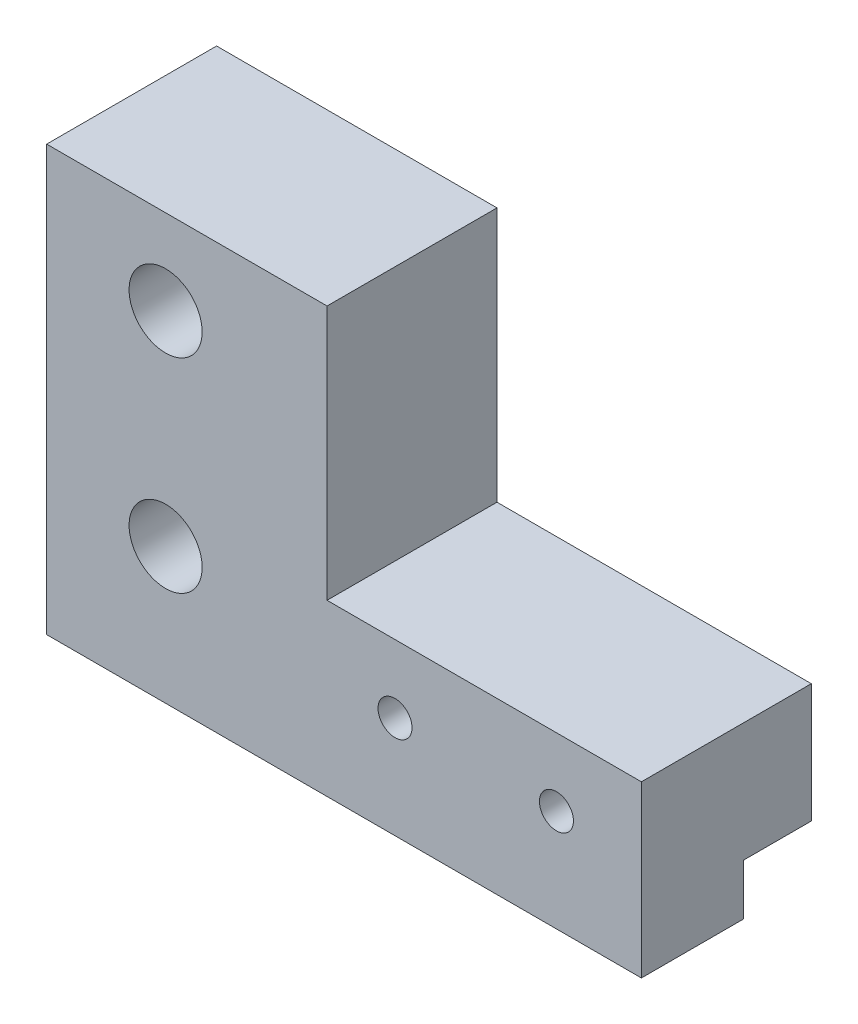
ISO-10303-21;
HEADER;
FILE_DESCRIPTION(('STEP AP214'),'2;1');
FILE_NAME('part.step','',(''),(''),'','','');
FILE_SCHEMA(('AUTOMOTIVE_DESIGN { 1 0 10303 214 1 1 1 1 }'));
ENDSEC;
DATA;
#1=APPLICATION_CONTEXT('core data for automotive mechanical design processes');
#2=APPLICATION_PROTOCOL_DEFINITION('international standard','automotive_design',2000,#1);
#3=PRODUCT_CONTEXT('',#1,'mechanical');
#4=PRODUCT('Part','Part','',(#3));
#5=PRODUCT_RELATED_PRODUCT_CATEGORY('part','',(#4));
#6=PRODUCT_DEFINITION_FORMATION('','',#4);
#7=PRODUCT_DEFINITION_CONTEXT('part definition',#1,'design');
#8=PRODUCT_DEFINITION('design','',#6,#7);
#9=PRODUCT_DEFINITION_SHAPE('','',#8);
#10=(LENGTH_UNIT() NAMED_UNIT(*) SI_UNIT(.MILLI.,.METRE.));
#11=(NAMED_UNIT(*) PLANE_ANGLE_UNIT() SI_UNIT($,.RADIAN.));
#12=(NAMED_UNIT(*) SI_UNIT($,.STERADIAN.) SOLID_ANGLE_UNIT());
#13=UNCERTAINTY_MEASURE_WITH_UNIT(LENGTH_MEASURE(1.E-05),#10,'distance_accuracy_value','');
#14=(GEOMETRIC_REPRESENTATION_CONTEXT(3) GLOBAL_UNCERTAINTY_ASSIGNED_CONTEXT((#13)) GLOBAL_UNIT_ASSIGNED_CONTEXT((#10,
#11,#12)) REPRESENTATION_CONTEXT('',''));
#15=CARTESIAN_POINT('',(0.,0.,0.));
#16=DIRECTION('',(0.,0.,1.));
#17=DIRECTION('',(1.,0.,0.));
#18=AXIS2_PLACEMENT_3D('',#15,#16,#17);
#19=CARTESIAN_POINT('',(0.,0.,10.));
#20=DIRECTION('',(0.,0.,1.));
#21=DIRECTION('',(1.,0.,0.));
#22=AXIS2_PLACEMENT_3D('',#19,#20,#21);
#23=PLANE('',#22);
#24=CARTESIAN_POINT('',(-17.,-14.,10.));
#25=DIRECTION('',(0.,0.,1.));
#26=DIRECTION('',(1.,0.,0.));
#27=AXIS2_PLACEMENT_3D('',#24,#25,#26);
#28=CIRCLE('',#27,1.);
#29=CARTESIAN_POINT('',(-16.,-14.,10.));
#30=VERTEX_POINT('',#29);
#31=EDGE_CURVE('E279',#30,#30,#28,.T.);
#32=ORIENTED_EDGE('',*,*,#31,.F.);
#33=EDGE_LOOP('',(#32));
#34=FACE_BOUND('',#33,.T.);
#35=CARTESIAN_POINT('',(-7.5,-14.,10.));
#36=DIRECTION('',(0.,0.,1.));
#37=DIRECTION('',(1.,0.,0.));
#38=AXIS2_PLACEMENT_3D('',#35,#36,#37);
#39=CIRCLE('',#38,1.);
#40=CARTESIAN_POINT('',(-6.5,-14.,10.));
#41=VERTEX_POINT('',#40);
#42=EDGE_CURVE('E273',#41,#41,#39,.T.);
#43=ORIENTED_EDGE('',*,*,#42,.F.);
#44=EDGE_LOOP('',(#43));
#45=FACE_BOUND('',#44,.T.);
#46=DIRECTION('',(0.,-1.,0.));
#47=VECTOR('',#46,1.);
#48=CARTESIAN_POINT('',(-2.5,4.99999999999999,10.));
#49=LINE('',#48,#47);
#50=CARTESIAN_POINT('',(-2.5,-10.,10.));
#51=VERTEX_POINT('',#50);
#52=CARTESIAN_POINT('',(-2.5,-20.,10.));
#53=VERTEX_POINT('',#52);
#54=EDGE_CURVE('E104',#51,#53,#49,.T.);
#55=ORIENTED_EDGE('',*,*,#54,.F.);
#56=DIRECTION('',(-1.,0.,0.));
#57=VECTOR('',#56,1.);
#58=CARTESIAN_POINT('',(-21.,-10.,10.));
#59=LINE('',#58,#57);
#60=CARTESIAN_POINT('',(-21.,-10.,10.));
#61=VERTEX_POINT('',#60);
#62=EDGE_CURVE('E121',#51,#61,#59,.T.);
#63=ORIENTED_EDGE('',*,*,#62,.T.);
#64=DIRECTION('',(0.,1.,0.));
#65=VECTOR('',#64,1.);
#66=CARTESIAN_POINT('',(-21.,4.99999999999999,10.));
#67=LINE('',#66,#65);
#68=CARTESIAN_POINT('',(-21.,4.99999999999999,10.));
#69=VERTEX_POINT('',#68);
#70=EDGE_CURVE('E123',#61,#69,#67,.T.);
#71=ORIENTED_EDGE('',*,*,#70,.T.);
#72=DIRECTION('',(-1.,0.,0.));
#73=VECTOR('',#72,1.);
#74=CARTESIAN_POINT('',(-37.5,4.99999999999999,10.));
#75=LINE('',#74,#73);
#76=CARTESIAN_POINT('',(-37.5,4.99999999999999,10.));
#77=VERTEX_POINT('',#76);
#78=EDGE_CURVE('E55',#69,#77,#75,.T.);
#79=ORIENTED_EDGE('',*,*,#78,.T.);
#80=DIRECTION('',(0.,-1.,0.));
#81=VECTOR('',#80,1.);
#82=CARTESIAN_POINT('',(-37.5,4.99999999999999,10.));
#83=LINE('',#82,#81);
#84=CARTESIAN_POINT('',(-37.5,-20.,10.));
#85=VERTEX_POINT('',#84);
#86=EDGE_CURVE('E119',#77,#85,#83,.T.);
#87=ORIENTED_EDGE('',*,*,#86,.T.);
#88=DIRECTION('',(1.,0.,0.));
#89=VECTOR('',#88,1.);
#90=CARTESIAN_POINT('',(-37.5,-20.,10.));
#91=LINE('',#90,#89);
#92=EDGE_CURVE('E80',#85,#53,#91,.T.);
#93=ORIENTED_EDGE('',*,*,#92,.T.);
#94=EDGE_LOOP('',(#55,#63,#71,#79,#87,#93));
#95=FACE_BOUND('',#94,.T.);
#96=CARTESIAN_POINT('',(-30.5,0.,10.));
#97=DIRECTION('',(0.,0.,1.));
#98=DIRECTION('',(1.,0.,0.));
#99=AXIS2_PLACEMENT_3D('',#96,#97,#98);
#100=CIRCLE('',#99,2.15);
#101=CARTESIAN_POINT('',(-28.35,0.,10.));
#102=VERTEX_POINT('',#101);
#103=EDGE_CURVE('E135',#102,#102,#100,.T.);
#104=ORIENTED_EDGE('',*,*,#103,.F.);
#105=EDGE_LOOP('',(#104));
#106=FACE_BOUND('',#105,.T.);
#107=CARTESIAN_POINT('',(-30.5,-12.,10.));
#108=DIRECTION('',(0.,0.,1.));
#109=DIRECTION('',(1.,0.,0.));
#110=AXIS2_PLACEMENT_3D('',#107,#108,#109);
#111=CIRCLE('',#110,2.15);
#112=CARTESIAN_POINT('',(-28.35,-12.,10.));
#113=VERTEX_POINT('',#112);
#114=EDGE_CURVE('E164',#113,#113,#111,.T.);
#115=ORIENTED_EDGE('',*,*,#114,.F.);
#116=EDGE_LOOP('',(#115));
#117=FACE_BOUND('',#116,.T.);
#118=ADVANCED_FACE('F32',(#34,#45,#95,#106,#117),#23,.T.);
#119=CARTESIAN_POINT('',(0.,0.,0.));
#120=DIRECTION('',(0.,0.,1.));
#121=DIRECTION('',(1.,0.,0.));
#122=AXIS2_PLACEMENT_3D('',#119,#120,#121);
#123=PLANE('',#122);
#124=CARTESIAN_POINT('',(-17.,-14.,0.));
#125=DIRECTION('',(0.,0.,1.));
#126=DIRECTION('',(1.,0.,0.));
#127=AXIS2_PLACEMENT_3D('',#124,#125,#126);
#128=CIRCLE('',#127,1.);
#129=CARTESIAN_POINT('',(-16.,-14.,0.));
#130=VERTEX_POINT('',#129);
#131=EDGE_CURVE('E276',#130,#130,#128,.T.);
#132=ORIENTED_EDGE('',*,*,#131,.T.);
#133=EDGE_LOOP('',(#132));
#134=FACE_BOUND('',#133,.T.);
#135=CARTESIAN_POINT('',(-7.5,-14.,0.));
#136=DIRECTION('',(0.,0.,1.));
#137=DIRECTION('',(1.,0.,0.));
#138=AXIS2_PLACEMENT_3D('',#135,#136,#137);
#139=CIRCLE('',#138,1.);
#140=CARTESIAN_POINT('',(-6.5,-14.,0.));
#141=VERTEX_POINT('',#140);
#142=EDGE_CURVE('E110',#141,#141,#139,.T.);
#143=ORIENTED_EDGE('',*,*,#142,.T.);
#144=EDGE_LOOP('',(#143));
#145=FACE_BOUND('',#144,.T.);
#146=CARTESIAN_POINT('',(-30.5,0.,0.));
#147=DIRECTION('',(0.,0.,1.));
#148=DIRECTION('',(1.,0.,0.));
#149=AXIS2_PLACEMENT_3D('',#146,#147,#148);
#150=CIRCLE('',#149,2.15);
#151=CARTESIAN_POINT('',(-28.35,0.,0.));
#152=VERTEX_POINT('',#151);
#153=EDGE_CURVE('E167',#152,#152,#150,.T.);
#154=ORIENTED_EDGE('',*,*,#153,.T.);
#155=EDGE_LOOP('',(#154));
#156=FACE_BOUND('',#155,.T.);
#157=DIRECTION('',(-1.,0.,0.));
#158=VECTOR('',#157,1.);
#159=CARTESIAN_POINT('',(-21.,-10.,0.));
#160=LINE('',#159,#158);
#161=CARTESIAN_POINT('',(-2.5,-10.,0.));
#162=VERTEX_POINT('',#161);
#163=CARTESIAN_POINT('',(-21.,-10.,0.));
#164=VERTEX_POINT('',#163);
#165=EDGE_CURVE('E134',#162,#164,#160,.T.);
#166=ORIENTED_EDGE('',*,*,#165,.F.);
#167=DIRECTION('',(0.,-1.,0.));
#168=VECTOR('',#167,1.);
#169=CARTESIAN_POINT('',(-2.5,4.99999999999999,0.));
#170=LINE('',#169,#168);
#171=CARTESIAN_POINT('',(-2.5,-17.,0.));
#172=VERTEX_POINT('',#171);
#173=EDGE_CURVE('E109',#162,#172,#170,.T.);
#174=ORIENTED_EDGE('',*,*,#173,.T.);
#175=DIRECTION('',(1.,0.,0.));
#176=VECTOR('',#175,1.);
#177=CARTESIAN_POINT('',(37.5,-17.,0.));
#178=LINE('',#177,#176);
#179=CARTESIAN_POINT('',(-37.5,-17.,0.));
#180=VERTEX_POINT('',#179);
#181=EDGE_CURVE('E156',#180,#172,#178,.T.);
#182=ORIENTED_EDGE('',*,*,#181,.F.);
#183=DIRECTION('',(0.,-1.,0.));
#184=VECTOR('',#183,1.);
#185=CARTESIAN_POINT('',(-37.5,4.99999999999999,0.));
#186=LINE('',#185,#184);
#187=CARTESIAN_POINT('',(-37.5,4.99999999999999,0.));
#188=VERTEX_POINT('',#187);
#189=EDGE_CURVE('E131',#188,#180,#186,.T.);
#190=ORIENTED_EDGE('',*,*,#189,.F.);
#191=DIRECTION('',(-1.,0.,0.));
#192=VECTOR('',#191,1.);
#193=CARTESIAN_POINT('',(-37.5,4.99999999999999,0.));
#194=LINE('',#193,#192);
#195=CARTESIAN_POINT('',(-21.,4.99999999999999,0.));
#196=VERTEX_POINT('',#195);
#197=EDGE_CURVE('E73',#196,#188,#194,.T.);
#198=ORIENTED_EDGE('',*,*,#197,.F.);
#199=DIRECTION('',(0.,1.,0.));
#200=VECTOR('',#199,1.);
#201=CARTESIAN_POINT('',(-21.,4.99999999999999,0.));
#202=LINE('',#201,#200);
#203=EDGE_CURVE('E137',#164,#196,#202,.T.);
#204=ORIENTED_EDGE('',*,*,#203,.F.);
#205=EDGE_LOOP('',(#166,#174,#182,#190,#198,#204));
#206=FACE_BOUND('',#205,.T.);
#207=CARTESIAN_POINT('',(-30.5,-12.,0.));
#208=DIRECTION('',(0.,0.,1.));
#209=DIRECTION('',(1.,0.,0.));
#210=AXIS2_PLACEMENT_3D('',#207,#208,#209);
#211=CIRCLE('',#210,2.15);
#212=CARTESIAN_POINT('',(-28.35,-12.,0.));
#213=VERTEX_POINT('',#212);
#214=EDGE_CURVE('E163',#213,#213,#211,.T.);
#215=ORIENTED_EDGE('',*,*,#214,.T.);
#216=EDGE_LOOP('',(#215));
#217=FACE_BOUND('',#216,.T.);
#218=ADVANCED_FACE('F174',(#134,#145,#156,#206,#217),#123,.F.);
#219=CARTESIAN_POINT('',(-37.5,4.99999999999999,10.));
#220=DIRECTION('',(1.,0.,0.));
#221=DIRECTION('',(0.,0.,-1.));
#222=AXIS2_PLACEMENT_3D('',#219,#220,#221);
#223=PLANE('',#222);
#224=ORIENTED_EDGE('',*,*,#189,.T.);
#225=DIRECTION('',(0.,0.,-1.));
#226=VECTOR('',#225,1.);
#227=CARTESIAN_POINT('',(-37.5,-17.,4.));
#228=LINE('',#227,#226);
#229=CARTESIAN_POINT('',(-37.5,-17.,4.));
#230=VERTEX_POINT('',#229);
#231=EDGE_CURVE('E149',#230,#180,#228,.T.);
#232=ORIENTED_EDGE('',*,*,#231,.F.);
#233=DIRECTION('',(0.,1.,0.));
#234=VECTOR('',#233,1.);
#235=CARTESIAN_POINT('',(-37.5,-20.,4.));
#236=LINE('',#235,#234);
#237=CARTESIAN_POINT('',(-37.5,-20.,4.));
#238=VERTEX_POINT('',#237);
#239=EDGE_CURVE('E148',#238,#230,#236,.T.);
#240=ORIENTED_EDGE('',*,*,#239,.F.);
#241=DIRECTION('',(0.,0.,-1.));
#242=VECTOR('',#241,1.);
#243=CARTESIAN_POINT('',(-37.5,-20.,10.));
#244=LINE('',#243,#242);
#245=EDGE_CURVE('E40',#85,#238,#244,.T.);
#246=ORIENTED_EDGE('',*,*,#245,.F.);
#247=ORIENTED_EDGE('',*,*,#86,.F.);
#248=DIRECTION('',(0.,0.,-1.));
#249=VECTOR('',#248,1.);
#250=CARTESIAN_POINT('',(-37.5,4.99999999999999,10.));
#251=LINE('',#250,#249);
#252=EDGE_CURVE('E130',#77,#188,#251,.T.);
#253=ORIENTED_EDGE('',*,*,#252,.T.);
#254=EDGE_LOOP('',(#224,#232,#240,#246,#247,#253));
#255=FACE_BOUND('',#254,.T.);
#256=ADVANCED_FACE('F34',(#255),#223,.F.);
#257=CARTESIAN_POINT('',(-37.5,-20.,10.));
#258=DIRECTION('',(0.,1.,0.));
#259=DIRECTION('',(0.,0.,1.));
#260=AXIS2_PLACEMENT_3D('',#257,#258,#259);
#261=PLANE('',#260);
#262=DIRECTION('',(-1.,0.,0.));
#263=VECTOR('',#262,1.);
#264=CARTESIAN_POINT('',(37.5,-20.,4.));
#265=LINE('',#264,#263);
#266=CARTESIAN_POINT('',(-2.5,-20.,4.));
#267=VERTEX_POINT('',#266);
#268=EDGE_CURVE('E114',#267,#238,#265,.T.);
#269=ORIENTED_EDGE('',*,*,#268,.F.);
#270=DIRECTION('',(0.,0.,1.));
#271=VECTOR('',#270,1.);
#272=CARTESIAN_POINT('',(-2.5,-20.,0.));
#273=LINE('',#272,#271);
#274=EDGE_CURVE('E47',#267,#53,#273,.T.);
#275=ORIENTED_EDGE('',*,*,#274,.T.);
#276=ORIENTED_EDGE('',*,*,#92,.F.);
#277=ORIENTED_EDGE('',*,*,#245,.T.);
#278=EDGE_LOOP('',(#269,#275,#276,#277));
#279=FACE_BOUND('',#278,.T.);
#280=ADVANCED_FACE('F113',(#279),#261,.F.);
#281=CARTESIAN_POINT('',(-21.,-10.,10.));
#282=DIRECTION('',(0.,-1.,0.));
#283=DIRECTION('',(0.,0.,-1.));
#284=AXIS2_PLACEMENT_3D('',#281,#282,#283);
#285=PLANE('',#284);
#286=ORIENTED_EDGE('',*,*,#62,.F.);
#287=DIRECTION('',(0.,0.,-1.));
#288=VECTOR('',#287,1.);
#289=CARTESIAN_POINT('',(-2.5,-10.,10.));
#290=LINE('',#289,#288);
#291=EDGE_CURVE('E107',#51,#162,#290,.T.);
#292=ORIENTED_EDGE('',*,*,#291,.T.);
#293=ORIENTED_EDGE('',*,*,#165,.T.);
#294=DIRECTION('',(0.,0.,-1.));
#295=VECTOR('',#294,1.);
#296=CARTESIAN_POINT('',(-21.,-10.,10.));
#297=LINE('',#296,#295);
#298=EDGE_CURVE('E143',#61,#164,#297,.T.);
#299=ORIENTED_EDGE('',*,*,#298,.F.);
#300=EDGE_LOOP('',(#286,#292,#293,#299));
#301=FACE_BOUND('',#300,.T.);
#302=ADVANCED_FACE('F205',(#301),#285,.F.);
#303=CARTESIAN_POINT('',(-21.,4.99999999999999,10.));
#304=DIRECTION('',(-1.,0.,0.));
#305=DIRECTION('',(0.,-1.,0.));
#306=AXIS2_PLACEMENT_3D('',#303,#304,#305);
#307=PLANE('',#306);
#308=ORIENTED_EDGE('',*,*,#203,.T.);
#309=DIRECTION('',(0.,0.,-1.));
#310=VECTOR('',#309,1.);
#311=CARTESIAN_POINT('',(-21.,4.99999999999999,10.));
#312=LINE('',#311,#310);
#313=EDGE_CURVE('E141',#69,#196,#312,.T.);
#314=ORIENTED_EDGE('',*,*,#313,.F.);
#315=ORIENTED_EDGE('',*,*,#70,.F.);
#316=ORIENTED_EDGE('',*,*,#298,.T.);
#317=EDGE_LOOP('',(#308,#314,#315,#316));
#318=FACE_BOUND('',#317,.T.);
#319=ADVANCED_FACE('F190',(#318),#307,.F.);
#320=CARTESIAN_POINT('',(-37.5,4.99999999999999,10.));
#321=DIRECTION('',(0.,-1.,0.));
#322=DIRECTION('',(0.,0.,-1.));
#323=AXIS2_PLACEMENT_3D('',#320,#321,#322);
#324=PLANE('',#323);
#325=ORIENTED_EDGE('',*,*,#197,.T.);
#326=ORIENTED_EDGE('',*,*,#252,.F.);
#327=ORIENTED_EDGE('',*,*,#78,.F.);
#328=ORIENTED_EDGE('',*,*,#313,.T.);
#329=EDGE_LOOP('',(#325,#326,#327,#328));
#330=FACE_BOUND('',#329,.T.);
#331=ADVANCED_FACE('F180',(#330),#324,.F.);
#332=CARTESIAN_POINT('',(-30.5,0.,10.));
#333=DIRECTION('',(0.,0.,-1.));
#334=DIRECTION('',(-1.,0.,0.));
#335=AXIS2_PLACEMENT_3D('',#332,#333,#334);
#336=CYLINDRICAL_SURFACE('',#335,2.15);
#337=ORIENTED_EDGE('',*,*,#103,.T.);
#338=EDGE_LOOP('',(#337));
#339=FACE_BOUND('',#338,.T.);
#340=ORIENTED_EDGE('',*,*,#153,.F.);
#341=EDGE_LOOP('',(#340));
#342=FACE_BOUND('',#341,.T.);
#343=ADVANCED_FACE('F177',(#339,#342),#336,.F.);
#344=CARTESIAN_POINT('',(-30.5,-12.,10.));
#345=DIRECTION('',(0.,0.,-1.));
#346=DIRECTION('',(-1.,0.,0.));
#347=AXIS2_PLACEMENT_3D('',#344,#345,#346);
#348=CYLINDRICAL_SURFACE('',#347,2.15);
#349=ORIENTED_EDGE('',*,*,#114,.T.);
#350=EDGE_LOOP('',(#349));
#351=FACE_BOUND('',#350,.T.);
#352=ORIENTED_EDGE('',*,*,#214,.F.);
#353=EDGE_LOOP('',(#352));
#354=FACE_BOUND('',#353,.T.);
#355=ADVANCED_FACE('F179',(#351,#354),#348,.F.);
#356=CARTESIAN_POINT('',(37.5,-17.,4.));
#357=DIRECTION('',(0.,1.,0.));
#358=DIRECTION('',(0.,0.,1.));
#359=AXIS2_PLACEMENT_3D('',#356,#357,#358);
#360=PLANE('',#359);
#361=ORIENTED_EDGE('',*,*,#181,.T.);
#362=DIRECTION('',(0.,0.,1.));
#363=VECTOR('',#362,1.);
#364=CARTESIAN_POINT('',(-2.5,-17.,4.));
#365=LINE('',#364,#363);
#366=CARTESIAN_POINT('',(-2.5,-17.,4.));
#367=VERTEX_POINT('',#366);
#368=EDGE_CURVE('E115',#172,#367,#365,.T.);
#369=ORIENTED_EDGE('',*,*,#368,.T.);
#370=DIRECTION('',(1.,0.,0.));
#371=VECTOR('',#370,1.);
#372=CARTESIAN_POINT('',(37.5,-17.,4.));
#373=LINE('',#372,#371);
#374=EDGE_CURVE('E153',#230,#367,#373,.T.);
#375=ORIENTED_EDGE('',*,*,#374,.F.);
#376=ORIENTED_EDGE('',*,*,#231,.T.);
#377=EDGE_LOOP('',(#361,#369,#375,#376));
#378=FACE_BOUND('',#377,.T.);
#379=ADVANCED_FACE('F187',(#378),#360,.F.);
#380=CARTESIAN_POINT('',(0.,0.,4.));
#381=DIRECTION('',(0.,0.,1.));
#382=DIRECTION('',(1.,0.,0.));
#383=AXIS2_PLACEMENT_3D('',#380,#381,#382);
#384=PLANE('',#383);
#385=ORIENTED_EDGE('',*,*,#374,.T.);
#386=DIRECTION('',(0.,-1.,0.));
#387=VECTOR('',#386,1.);
#388=CARTESIAN_POINT('',(-2.5,0.,4.));
#389=LINE('',#388,#387);
#390=EDGE_CURVE('E11',#367,#267,#389,.T.);
#391=ORIENTED_EDGE('',*,*,#390,.T.);
#392=ORIENTED_EDGE('',*,*,#268,.T.);
#393=ORIENTED_EDGE('',*,*,#239,.T.);
#394=EDGE_LOOP('',(#385,#391,#392,#393));
#395=FACE_BOUND('',#394,.T.);
#396=ADVANCED_FACE('F253',(#395),#384,.F.);
#397=CARTESIAN_POINT('',(-2.5,4.99999999999999,0.));
#398=DIRECTION('',(-1.,0.,0.));
#399=DIRECTION('',(0.,0.,1.));
#400=AXIS2_PLACEMENT_3D('',#397,#398,#399);
#401=PLANE('',#400);
#402=ORIENTED_EDGE('',*,*,#54,.T.);
#403=ORIENTED_EDGE('',*,*,#274,.F.);
#404=ORIENTED_EDGE('',*,*,#390,.F.);
#405=ORIENTED_EDGE('',*,*,#368,.F.);
#406=ORIENTED_EDGE('',*,*,#173,.F.);
#407=ORIENTED_EDGE('',*,*,#291,.F.);
#408=EDGE_LOOP('',(#402,#403,#404,#405,#406,#407));
#409=FACE_BOUND('',#408,.T.);
#410=ADVANCED_FACE('F105',(#409),#401,.F.);
#411=CARTESIAN_POINT('',(-7.5,-14.,0.));
#412=DIRECTION('',(0.,0.,1.));
#413=DIRECTION('',(1.,0.,0.));
#414=AXIS2_PLACEMENT_3D('',#411,#412,#413);
#415=CYLINDRICAL_SURFACE('',#414,1.);
#416=ORIENTED_EDGE('',*,*,#142,.F.);
#417=EDGE_LOOP('',(#416));
#418=FACE_BOUND('',#417,.T.);
#419=ORIENTED_EDGE('',*,*,#42,.T.);
#420=EDGE_LOOP('',(#419));
#421=FACE_BOUND('',#420,.T.);
#422=ADVANCED_FACE('F228',(#418,#421),#415,.F.);
#423=CARTESIAN_POINT('',(-17.,-14.,0.));
#424=DIRECTION('',(0.,0.,1.));
#425=DIRECTION('',(1.,0.,0.));
#426=AXIS2_PLACEMENT_3D('',#423,#424,#425);
#427=CYLINDRICAL_SURFACE('',#426,1.);
#428=ORIENTED_EDGE('',*,*,#131,.F.);
#429=EDGE_LOOP('',(#428));
#430=FACE_BOUND('',#429,.T.);
#431=ORIENTED_EDGE('',*,*,#31,.T.);
#432=EDGE_LOOP('',(#431));
#433=FACE_BOUND('',#432,.T.);
#434=ADVANCED_FACE('F233',(#430,#433),#427,.F.);
#435=CLOSED_SHELL('',(#118,#218,#256,#280,#302,#319,#331,#343,#355,#379,#396,#410,#422,#434));
#436=MANIFOLD_SOLID_BREP('B2',#435);
#437=ADVANCED_BREP_SHAPE_REPRESENTATION('',(#18,#436),#14);
#438=SHAPE_DEFINITION_REPRESENTATION(#9,#437);
ENDSEC;
END-ISO-10303-21;
